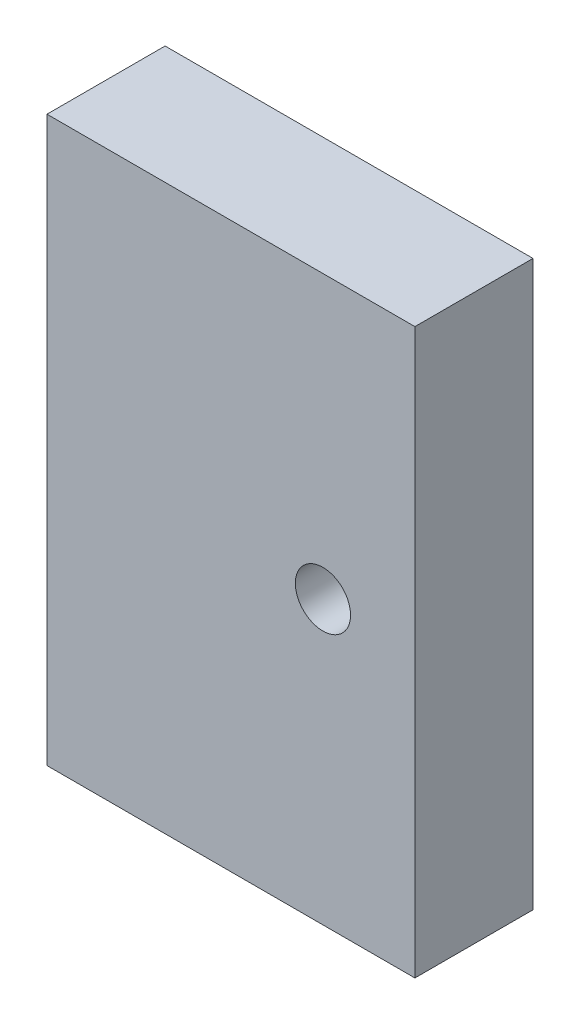
ISO-10303-21;
HEADER;
FILE_DESCRIPTION(('STEP AP214'),'2;1');
FILE_NAME('part.step','',(''),(''),'','','');
FILE_SCHEMA(('AUTOMOTIVE_DESIGN { 1 0 10303 214 1 1 1 1 }'));
ENDSEC;
DATA;
#1=APPLICATION_CONTEXT('core data for automotive mechanical design processes');
#2=APPLICATION_PROTOCOL_DEFINITION('international standard','automotive_design',2000,#1);
#3=PRODUCT_CONTEXT('',#1,'mechanical');
#4=PRODUCT('Part','Part','',(#3));
#5=PRODUCT_RELATED_PRODUCT_CATEGORY('part','',(#4));
#6=PRODUCT_DEFINITION_FORMATION('','',#4);
#7=PRODUCT_DEFINITION_CONTEXT('part definition',#1,'design');
#8=PRODUCT_DEFINITION('design','',#6,#7);
#9=PRODUCT_DEFINITION_SHAPE('','',#8);
#10=(LENGTH_UNIT() NAMED_UNIT(*) SI_UNIT(.MILLI.,.METRE.));
#11=(NAMED_UNIT(*) PLANE_ANGLE_UNIT() SI_UNIT($,.RADIAN.));
#12=(NAMED_UNIT(*) SI_UNIT($,.STERADIAN.) SOLID_ANGLE_UNIT());
#13=UNCERTAINTY_MEASURE_WITH_UNIT(LENGTH_MEASURE(1.E-05),#10,'distance_accuracy_value','');
#14=(GEOMETRIC_REPRESENTATION_CONTEXT(3) GLOBAL_UNCERTAINTY_ASSIGNED_CONTEXT((#13)) GLOBAL_UNIT_ASSIGNED_CONTEXT((#10,
#11,#12)) REPRESENTATION_CONTEXT('',''));
#15=CARTESIAN_POINT('',(0.,0.,0.));
#16=DIRECTION('',(0.,0.,1.));
#17=DIRECTION('',(1.,0.,0.));
#18=AXIS2_PLACEMENT_3D('',#15,#16,#17);
#19=CARTESIAN_POINT('',(15.,23.,9.63));
#20=DIRECTION('',(-1.,0.,0.));
#21=DIRECTION('',(0.,0.,1.));
#22=AXIS2_PLACEMENT_3D('',#19,#20,#21);
#23=PLANE('',#22);
#24=DIRECTION('',(0.,1.,0.));
#25=VECTOR('',#24,1.);
#26=CARTESIAN_POINT('',(15.,23.,0.));
#27=LINE('',#26,#25);
#28=CARTESIAN_POINT('',(15.,-23.,0.));
#29=VERTEX_POINT('',#28);
#30=CARTESIAN_POINT('',(15.,23.,0.));
#31=VERTEX_POINT('',#30);
#32=EDGE_CURVE('E115',#29,#31,#27,.T.);
#33=ORIENTED_EDGE('',*,*,#32,.T.);
#34=DIRECTION('',(0.,0.,-1.));
#35=VECTOR('',#34,1.);
#36=CARTESIAN_POINT('',(15.,23.,9.63));
#37=LINE('',#36,#35);
#38=CARTESIAN_POINT('',(15.,23.,9.63));
#39=VERTEX_POINT('',#38);
#40=EDGE_CURVE('E11',#39,#31,#37,.T.);
#41=ORIENTED_EDGE('',*,*,#40,.F.);
#42=DIRECTION('',(0.,1.,0.));
#43=VECTOR('',#42,1.);
#44=CARTESIAN_POINT('',(15.,23.,9.63));
#45=LINE('',#44,#43);
#46=CARTESIAN_POINT('',(15.,-23.,9.63));
#47=VERTEX_POINT('',#46);
#48=EDGE_CURVE('E98',#47,#39,#45,.T.);
#49=ORIENTED_EDGE('',*,*,#48,.F.);
#50=DIRECTION('',(0.,0.,-1.));
#51=VECTOR('',#50,1.);
#52=CARTESIAN_POINT('',(15.,-23.,9.63));
#53=LINE('',#52,#51);
#54=EDGE_CURVE('E111',#47,#29,#53,.T.);
#55=ORIENTED_EDGE('',*,*,#54,.T.);
#56=EDGE_LOOP('',(#33,#41,#49,#55));
#57=FACE_BOUND('',#56,.T.);
#58=ADVANCED_FACE('F45',(#57),#23,.F.);
#59=CARTESIAN_POINT('',(15.,23.,9.63));
#60=DIRECTION('',(0.,-1.,0.));
#61=DIRECTION('',(0.,0.,-1.));
#62=AXIS2_PLACEMENT_3D('',#59,#60,#61);
#63=PLANE('',#62);
#64=DIRECTION('',(-1.,0.,0.));
#65=VECTOR('',#64,1.);
#66=CARTESIAN_POINT('',(15.,23.,0.));
#67=LINE('',#66,#65);
#68=CARTESIAN_POINT('',(-15.,23.,0.));
#69=VERTEX_POINT('',#68);
#70=EDGE_CURVE('E103',#31,#69,#67,.T.);
#71=ORIENTED_EDGE('',*,*,#70,.T.);
#72=DIRECTION('',(0.,0.,-1.));
#73=VECTOR('',#72,1.);
#74=CARTESIAN_POINT('',(-15.,23.,9.63));
#75=LINE('',#74,#73);
#76=CARTESIAN_POINT('',(-15.,23.,9.63));
#77=VERTEX_POINT('',#76);
#78=EDGE_CURVE('E55',#77,#69,#75,.T.);
#79=ORIENTED_EDGE('',*,*,#78,.F.);
#80=DIRECTION('',(-1.,0.,0.));
#81=VECTOR('',#80,1.);
#82=CARTESIAN_POINT('',(15.,23.,9.63));
#83=LINE('',#82,#81);
#84=EDGE_CURVE('E93',#39,#77,#83,.T.);
#85=ORIENTED_EDGE('',*,*,#84,.F.);
#86=ORIENTED_EDGE('',*,*,#40,.T.);
#87=EDGE_LOOP('',(#71,#79,#85,#86));
#88=FACE_BOUND('',#87,.T.);
#89=ADVANCED_FACE('F102',(#88),#63,.F.);
#90=CARTESIAN_POINT('',(-15.,23.,9.63));
#91=DIRECTION('',(1.,0.,0.));
#92=DIRECTION('',(0.,0.,-1.));
#93=AXIS2_PLACEMENT_3D('',#90,#91,#92);
#94=PLANE('',#93);
#95=DIRECTION('',(0.,-1.,0.));
#96=VECTOR('',#95,1.);
#97=CARTESIAN_POINT('',(-15.,23.,0.));
#98=LINE('',#97,#96);
#99=CARTESIAN_POINT('',(-15.,-23.,0.));
#100=VERTEX_POINT('',#99);
#101=EDGE_CURVE('E80',#69,#100,#98,.T.);
#102=ORIENTED_EDGE('',*,*,#101,.T.);
#103=DIRECTION('',(0.,0.,-1.));
#104=VECTOR('',#103,1.);
#105=CARTESIAN_POINT('',(-15.,-23.,9.63));
#106=LINE('',#105,#104);
#107=CARTESIAN_POINT('',(-15.,-23.,9.63));
#108=VERTEX_POINT('',#107);
#109=EDGE_CURVE('E105',#108,#100,#106,.T.);
#110=ORIENTED_EDGE('',*,*,#109,.F.);
#111=DIRECTION('',(0.,-1.,0.));
#112=VECTOR('',#111,1.);
#113=CARTESIAN_POINT('',(-15.,23.,9.63));
#114=LINE('',#113,#112);
#115=EDGE_CURVE('E96',#77,#108,#114,.T.);
#116=ORIENTED_EDGE('',*,*,#115,.F.);
#117=ORIENTED_EDGE('',*,*,#78,.T.);
#118=EDGE_LOOP('',(#102,#110,#116,#117));
#119=FACE_BOUND('',#118,.T.);
#120=ADVANCED_FACE('F107',(#119),#94,.F.);
#121=CARTESIAN_POINT('',(-15.,-23.,9.63));
#122=DIRECTION('',(0.,1.,0.));
#123=DIRECTION('',(0.,0.,1.));
#124=AXIS2_PLACEMENT_3D('',#121,#122,#123);
#125=PLANE('',#124);
#126=CARTESIAN_POINT('',(-1.98990934883625,-23.,4.78745111249896));
#127=DIRECTION('',(0.,-1.,0.));
#128=DIRECTION('',(0.,0.,-1.));
#129=AXIS2_PLACEMENT_3D('',#126,#127,#128);
#130=CIRCLE('',#129,1.75);
#131=CARTESIAN_POINT('',(-1.98990934883625,-23.,3.03745111249896));
#132=VERTEX_POINT('',#131);
#133=EDGE_CURVE('E144',#132,#132,#130,.T.);
#134=ORIENTED_EDGE('',*,*,#133,.F.);
#135=EDGE_LOOP('',(#134));
#136=FACE_BOUND('',#135,.T.);
#137=CARTESIAN_POINT('',(10.0054173006896,-23.,4.78745111249895));
#138=DIRECTION('',(0.,-1.,0.));
#139=DIRECTION('',(0.,0.,-1.));
#140=AXIS2_PLACEMENT_3D('',#137,#138,#139);
#141=CIRCLE('',#140,1.75);
#142=CARTESIAN_POINT('',(10.0054173006896,-23.,3.03745111249895));
#143=VERTEX_POINT('',#142);
#144=EDGE_CURVE('E140',#143,#143,#141,.T.);
#145=ORIENTED_EDGE('',*,*,#144,.F.);
#146=EDGE_LOOP('',(#145));
#147=FACE_BOUND('',#146,.T.);
#148=DIRECTION('',(1.,0.,0.));
#149=VECTOR('',#148,1.);
#150=CARTESIAN_POINT('',(-15.,-23.,0.));
#151=LINE('',#150,#149);
#152=EDGE_CURVE('E86',#100,#29,#151,.T.);
#153=ORIENTED_EDGE('',*,*,#152,.T.);
#154=ORIENTED_EDGE('',*,*,#54,.F.);
#155=DIRECTION('',(1.,0.,0.));
#156=VECTOR('',#155,1.);
#157=CARTESIAN_POINT('',(-15.,-23.,9.63));
#158=LINE('',#157,#156);
#159=EDGE_CURVE('E63',#108,#47,#158,.T.);
#160=ORIENTED_EDGE('',*,*,#159,.F.);
#161=ORIENTED_EDGE('',*,*,#109,.T.);
#162=EDGE_LOOP('',(#153,#154,#160,#161));
#163=FACE_BOUND('',#162,.T.);
#164=ADVANCED_FACE('F129',(#136,#147,#163),#125,.F.);
#165=CARTESIAN_POINT('',(0.,0.,9.63));
#166=DIRECTION('',(0.,0.,1.));
#167=DIRECTION('',(1.,0.,0.));
#168=AXIS2_PLACEMENT_3D('',#165,#166,#167);
#169=PLANE('',#168);
#170=CARTESIAN_POINT('',(7.5,0.,9.63));
#171=DIRECTION('',(0.,0.,1.));
#172=DIRECTION('',(1.,0.,0.));
#173=AXIS2_PLACEMENT_3D('',#170,#171,#172);
#174=CIRCLE('',#173,2.25);
#175=CARTESIAN_POINT('',(9.75,0.,9.63));
#176=VERTEX_POINT('',#175);
#177=EDGE_CURVE('E151',#176,#176,#174,.T.);
#178=ORIENTED_EDGE('',*,*,#177,.F.);
#179=EDGE_LOOP('',(#178));
#180=FACE_BOUND('',#179,.T.);
#181=ORIENTED_EDGE('',*,*,#48,.T.);
#182=ORIENTED_EDGE('',*,*,#84,.T.);
#183=ORIENTED_EDGE('',*,*,#115,.T.);
#184=ORIENTED_EDGE('',*,*,#159,.T.);
#185=EDGE_LOOP('',(#181,#182,#183,#184));
#186=FACE_BOUND('',#185,.T.);
#187=ADVANCED_FACE('F94',(#180,#186),#169,.T.);
#188=CARTESIAN_POINT('',(0.,0.,0.));
#189=DIRECTION('',(0.,0.,1.));
#190=DIRECTION('',(1.,0.,0.));
#191=AXIS2_PLACEMENT_3D('',#188,#189,#190);
#192=PLANE('',#191);
#193=CARTESIAN_POINT('',(7.5,0.,0.));
#194=DIRECTION('',(0.,0.,1.));
#195=DIRECTION('',(1.,0.,0.));
#196=AXIS2_PLACEMENT_3D('',#193,#194,#195);
#197=CIRCLE('',#196,2.25);
#198=CARTESIAN_POINT('',(9.75,0.,0.));
#199=VERTEX_POINT('',#198);
#200=EDGE_CURVE('E48',#199,#199,#197,.T.);
#201=ORIENTED_EDGE('',*,*,#200,.T.);
#202=EDGE_LOOP('',(#201));
#203=FACE_BOUND('',#202,.T.);
#204=ORIENTED_EDGE('',*,*,#32,.F.);
#205=ORIENTED_EDGE('',*,*,#152,.F.);
#206=ORIENTED_EDGE('',*,*,#101,.F.);
#207=ORIENTED_EDGE('',*,*,#70,.F.);
#208=EDGE_LOOP('',(#204,#205,#206,#207));
#209=FACE_BOUND('',#208,.T.);
#210=ADVANCED_FACE('F132',(#203,#209),#192,.F.);
#211=CARTESIAN_POINT('',(10.0054173006896,-15.,4.78745111249895));
#212=DIRECTION('',(0.,-1.,0.));
#213=DIRECTION('',(0.,0.,-1.));
#214=AXIS2_PLACEMENT_3D('',#211,#212,#213);
#215=CYLINDRICAL_SURFACE('',#214,1.75);
#216=CARTESIAN_POINT('',(10.0054173006896,-15.,4.78745111249895));
#217=DIRECTION('',(0.,-1.,0.));
#218=DIRECTION('',(0.,0.,-1.));
#219=AXIS2_PLACEMENT_3D('',#216,#217,#218);
#220=CIRCLE('',#219,1.75);
#221=CARTESIAN_POINT('',(10.0054173006896,-15.,3.03745111249895));
#222=VERTEX_POINT('',#221);
#223=EDGE_CURVE('E136',#222,#222,#220,.T.);
#224=ORIENTED_EDGE('',*,*,#223,.F.);
#225=EDGE_LOOP('',(#224));
#226=FACE_BOUND('',#225,.T.);
#227=ORIENTED_EDGE('',*,*,#144,.T.);
#228=EDGE_LOOP('',(#227));
#229=FACE_BOUND('',#228,.T.);
#230=ADVANCED_FACE('F185',(#226,#229),#215,.F.);
#231=CARTESIAN_POINT('',(10.0054173006896,-15.,4.78745111249895));
#232=DIRECTION('',(0.,-1.,0.));
#233=DIRECTION('',(0.,0.,-1.));
#234=AXIS2_PLACEMENT_3D('',#231,#232,#233);
#235=PLANE('',#234);
#236=ORIENTED_EDGE('',*,*,#223,.T.);
#237=EDGE_LOOP('',(#236));
#238=FACE_BOUND('',#237,.T.);
#239=ADVANCED_FACE('F189',(#238),#235,.T.);
#240=CARTESIAN_POINT('',(-1.98990934883625,-15.,4.78745111249896));
#241=DIRECTION('',(0.,-1.,0.));
#242=DIRECTION('',(0.,0.,-1.));
#243=AXIS2_PLACEMENT_3D('',#240,#241,#242);
#244=CYLINDRICAL_SURFACE('',#243,1.75);
#245=CARTESIAN_POINT('',(-1.98990934883625,-15.,4.78745111249896));
#246=DIRECTION('',(0.,-1.,0.));
#247=DIRECTION('',(0.,0.,-1.));
#248=AXIS2_PLACEMENT_3D('',#245,#246,#247);
#249=CIRCLE('',#248,1.75);
#250=CARTESIAN_POINT('',(-1.98990934883625,-15.,3.03745111249896));
#251=VERTEX_POINT('',#250);
#252=EDGE_CURVE('E119',#251,#251,#249,.T.);
#253=ORIENTED_EDGE('',*,*,#252,.F.);
#254=EDGE_LOOP('',(#253));
#255=FACE_BOUND('',#254,.T.);
#256=ORIENTED_EDGE('',*,*,#133,.T.);
#257=EDGE_LOOP('',(#256));
#258=FACE_BOUND('',#257,.T.);
#259=ADVANCED_FACE('F169',(#255,#258),#244,.F.);
#260=CARTESIAN_POINT('',(-1.98990934883625,-15.,4.78745111249896));
#261=DIRECTION('',(0.,-1.,0.));
#262=DIRECTION('',(0.,0.,-1.));
#263=AXIS2_PLACEMENT_3D('',#260,#261,#262);
#264=PLANE('',#263);
#265=ORIENTED_EDGE('',*,*,#252,.T.);
#266=EDGE_LOOP('',(#265));
#267=FACE_BOUND('',#266,.T.);
#268=ADVANCED_FACE('F163',(#267),#264,.T.);
#269=CARTESIAN_POINT('',(7.5,0.,-0.369999999999999));
#270=DIRECTION('',(0.,0.,1.));
#271=DIRECTION('',(1.,0.,0.));
#272=AXIS2_PLACEMENT_3D('',#269,#270,#271);
#273=CYLINDRICAL_SURFACE('',#272,2.25);
#274=ORIENTED_EDGE('',*,*,#177,.T.);
#275=EDGE_LOOP('',(#274));
#276=FACE_BOUND('',#275,.T.);
#277=ORIENTED_EDGE('',*,*,#200,.F.);
#278=EDGE_LOOP('',(#277));
#279=FACE_BOUND('',#278,.T.);
#280=ADVANCED_FACE('F161',(#276,#279),#273,.F.);
#281=CLOSED_SHELL('',(#58,#89,#120,#164,#187,#210,#230,#239,#259,#268,#280));
#282=MANIFOLD_SOLID_BREP('B2',#281);
#283=ADVANCED_BREP_SHAPE_REPRESENTATION('',(#18,#282),#14);
#284=SHAPE_DEFINITION_REPRESENTATION(#9,#283);
ENDSEC;
END-ISO-10303-21;
